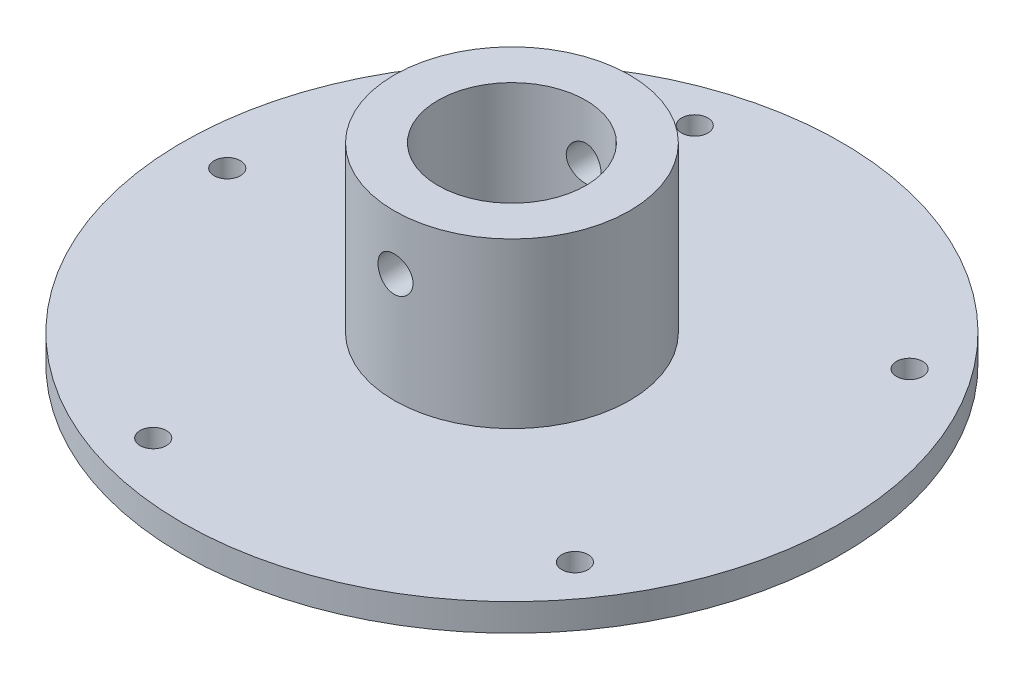
ISO-10303-21;
HEADER;
FILE_DESCRIPTION(('STEP AP214'),'2;1');
FILE_NAME('part.step','',(''),(''),'','','');
FILE_SCHEMA(('AUTOMOTIVE_DESIGN { 1 0 10303 214 1 1 1 1 }'));
ENDSEC;
DATA;
#1=APPLICATION_CONTEXT('core data for automotive mechanical design processes');
#2=APPLICATION_PROTOCOL_DEFINITION('international standard','automotive_design',2000,#1);
#3=PRODUCT_CONTEXT('',#1,'mechanical');
#4=PRODUCT('Part','Part','',(#3));
#5=PRODUCT_RELATED_PRODUCT_CATEGORY('part','',(#4));
#6=PRODUCT_DEFINITION_FORMATION('','',#4);
#7=PRODUCT_DEFINITION_CONTEXT('part definition',#1,'design');
#8=PRODUCT_DEFINITION('design','',#6,#7);
#9=PRODUCT_DEFINITION_SHAPE('','',#8);
#10=(LENGTH_UNIT() NAMED_UNIT(*) SI_UNIT(.MILLI.,.METRE.));
#11=(NAMED_UNIT(*) PLANE_ANGLE_UNIT() SI_UNIT($,.RADIAN.));
#12=(NAMED_UNIT(*) SI_UNIT($,.STERADIAN.) SOLID_ANGLE_UNIT());
#13=UNCERTAINTY_MEASURE_WITH_UNIT(LENGTH_MEASURE(1.E-05),#10,'distance_accuracy_value','');
#14=(GEOMETRIC_REPRESENTATION_CONTEXT(3) GLOBAL_UNCERTAINTY_ASSIGNED_CONTEXT((#13)) GLOBAL_UNIT_ASSIGNED_CONTEXT((#10,
#11,#12)) REPRESENTATION_CONTEXT('',''));
#15=CARTESIAN_POINT('',(0.,0.,0.));
#16=DIRECTION('',(0.,0.,1.));
#17=DIRECTION('',(1.,0.,0.));
#18=AXIS2_PLACEMENT_3D('',#15,#16,#17);
#19=CARTESIAN_POINT('',(0.,2.5,0.));
#20=DIRECTION('',(0.,1.,0.));
#21=DIRECTION('',(0.,0.,1.));
#22=AXIS2_PLACEMENT_3D('',#19,#20,#21);
#23=PLANE('',#22);
#24=CARTESIAN_POINT('',(-8.03444185374863,2.5,24.727469423674));
#25=DIRECTION('',(0.,1.,0.));
#26=DIRECTION('',(0.,0.,1.));
#27=AXIS2_PLACEMENT_3D('',#24,#25,#26);
#28=CIRCLE('',#27,1.2);
#29=CARTESIAN_POINT('',(-8.03444185374863,2.5,25.927469423674));
#30=VERTEX_POINT('',#29);
#31=EDGE_CURVE('E148',#30,#30,#28,.T.);
#32=ORIENTED_EDGE('',*,*,#31,.F.);
#33=EDGE_LOOP('',(#32));
#34=FACE_BOUND('',#33,.T.);
#35=CARTESIAN_POINT('',(21.0344418537486,2.5,-15.2824165596043));
#36=DIRECTION('',(0.,1.,0.));
#37=DIRECTION('',(0.,0.,1.));
#38=AXIS2_PLACEMENT_3D('',#35,#36,#37);
#39=CIRCLE('',#38,1.2);
#40=CARTESIAN_POINT('',(21.0344418537486,2.5,-14.0824165596043));
#41=VERTEX_POINT('',#40);
#42=EDGE_CURVE('E162',#41,#41,#39,.T.);
#43=ORIENTED_EDGE('',*,*,#42,.F.);
#44=EDGE_LOOP('',(#43));
#45=FACE_BOUND('',#44,.T.);
#46=CARTESIAN_POINT('',(0.,2.5,0.));
#47=DIRECTION('',(0.,1.,0.));
#48=DIRECTION('',(0.,0.,1.));
#49=AXIS2_PLACEMENT_3D('',#46,#47,#48);
#50=CIRCLE('',#49,30.1);
#51=CARTESIAN_POINT('',(0.,2.5,30.1));
#52=VERTEX_POINT('',#51);
#53=EDGE_CURVE('E10',#52,#52,#50,.T.);
#54=ORIENTED_EDGE('',*,*,#53,.T.);
#55=EDGE_LOOP('',(#54));
#56=FACE_BOUND('',#55,.T.);
#57=CARTESIAN_POINT('',(-26.,2.5,0.));
#58=DIRECTION('',(0.,1.,0.));
#59=DIRECTION('',(0.,0.,1.));
#60=AXIS2_PLACEMENT_3D('',#57,#58,#59);
#61=CIRCLE('',#60,1.2);
#62=CARTESIAN_POINT('',(-26.,2.5,1.2));
#63=VERTEX_POINT('',#62);
#64=EDGE_CURVE('E65',#63,#63,#61,.T.);
#65=ORIENTED_EDGE('',*,*,#64,.F.);
#66=EDGE_LOOP('',(#65));
#67=FACE_BOUND('',#66,.T.);
#68=CARTESIAN_POINT('',(-8.03444185374864,2.5,-24.727469423674));
#69=DIRECTION('',(0.,1.,0.));
#70=DIRECTION('',(0.,0.,1.));
#71=AXIS2_PLACEMENT_3D('',#68,#69,#70);
#72=CIRCLE('',#71,1.2);
#73=CARTESIAN_POINT('',(-8.03444185374864,2.5,-23.527469423674));
#74=VERTEX_POINT('',#73);
#75=EDGE_CURVE('E166',#74,#74,#72,.T.);
#76=ORIENTED_EDGE('',*,*,#75,.F.);
#77=EDGE_LOOP('',(#76));
#78=FACE_BOUND('',#77,.T.);
#79=CARTESIAN_POINT('',(21.0344418537486,2.5,15.2824165596043));
#80=DIRECTION('',(0.,1.,0.));
#81=DIRECTION('',(0.,0.,1.));
#82=AXIS2_PLACEMENT_3D('',#79,#80,#81);
#83=CIRCLE('',#82,1.2);
#84=CARTESIAN_POINT('',(21.0344418537486,2.5,16.4824165596043));
#85=VERTEX_POINT('',#84);
#86=EDGE_CURVE('E158',#85,#85,#83,.T.);
#87=ORIENTED_EDGE('',*,*,#86,.F.);
#88=EDGE_LOOP('',(#87));
#89=FACE_BOUND('',#88,.T.);
#90=CARTESIAN_POINT('',(0.,2.5,0.));
#91=DIRECTION('',(0.,1.,0.));
#92=DIRECTION('',(0.,0.,1.));
#93=AXIS2_PLACEMENT_3D('',#90,#91,#92);
#94=CIRCLE('',#93,10.75);
#95=CARTESIAN_POINT('',(0.,2.5,10.75));
#96=VERTEX_POINT('',#95);
#97=EDGE_CURVE('E154',#96,#96,#94,.T.);
#98=ORIENTED_EDGE('',*,*,#97,.F.);
#99=EDGE_LOOP('',(#98));
#100=FACE_BOUND('',#99,.T.);
#101=ADVANCED_FACE('F47',(#34,#45,#56,#67,#78,#89,#100),#23,.T.);
#102=CARTESIAN_POINT('',(0.,0.,0.));
#103=DIRECTION('',(0.,1.,0.));
#104=DIRECTION('',(0.,0.,1.));
#105=AXIS2_PLACEMENT_3D('',#102,#103,#104);
#106=PLANE('',#105);
#107=CARTESIAN_POINT('',(0.,0.,0.));
#108=DIRECTION('',(0.,1.,0.));
#109=DIRECTION('',(0.,0.,1.));
#110=AXIS2_PLACEMENT_3D('',#107,#108,#109);
#111=CIRCLE('',#110,30.1);
#112=CARTESIAN_POINT('',(0.,0.,30.1));
#113=VERTEX_POINT('',#112);
#114=EDGE_CURVE('E60',#113,#113,#111,.T.);
#115=ORIENTED_EDGE('',*,*,#114,.F.);
#116=EDGE_LOOP('',(#115));
#117=FACE_BOUND('',#116,.T.);
#118=CARTESIAN_POINT('',(-26.,0.,0.));
#119=DIRECTION('',(0.,1.,0.));
#120=DIRECTION('',(0.,0.,1.));
#121=AXIS2_PLACEMENT_3D('',#118,#119,#120);
#122=CIRCLE('',#121,1.2);
#123=CARTESIAN_POINT('',(-26.,0.,1.2));
#124=VERTEX_POINT('',#123);
#125=EDGE_CURVE('E68',#124,#124,#122,.T.);
#126=ORIENTED_EDGE('',*,*,#125,.T.);
#127=EDGE_LOOP('',(#126));
#128=FACE_BOUND('',#127,.T.);
#129=CARTESIAN_POINT('',(0.,0.,0.));
#130=DIRECTION('',(0.,1.,0.));
#131=DIRECTION('',(0.,0.,1.));
#132=AXIS2_PLACEMENT_3D('',#129,#130,#131);
#133=CIRCLE('',#132,6.75);
#134=CARTESIAN_POINT('',(0.,0.,6.75));
#135=VERTEX_POINT('',#134);
#136=EDGE_CURVE('E131',#135,#135,#133,.T.);
#137=ORIENTED_EDGE('',*,*,#136,.T.);
#138=EDGE_LOOP('',(#137));
#139=FACE_BOUND('',#138,.T.);
#140=CARTESIAN_POINT('',(-8.03444185374864,0.,-24.727469423674));
#141=DIRECTION('',(0.,1.,0.));
#142=DIRECTION('',(0.,0.,1.));
#143=AXIS2_PLACEMENT_3D('',#140,#141,#142);
#144=CIRCLE('',#143,1.2);
#145=CARTESIAN_POINT('',(-8.03444185374864,0.,-23.527469423674));
#146=VERTEX_POINT('',#145);
#147=EDGE_CURVE('E135',#146,#146,#144,.T.);
#148=ORIENTED_EDGE('',*,*,#147,.T.);
#149=EDGE_LOOP('',(#148));
#150=FACE_BOUND('',#149,.T.);
#151=CARTESIAN_POINT('',(21.0344418537486,0.,-15.2824165596043));
#152=DIRECTION('',(0.,1.,0.));
#153=DIRECTION('',(0.,0.,1.));
#154=AXIS2_PLACEMENT_3D('',#151,#152,#153);
#155=CIRCLE('',#154,1.2);
#156=CARTESIAN_POINT('',(21.0344418537486,0.,-14.0824165596043));
#157=VERTEX_POINT('',#156);
#158=EDGE_CURVE('E139',#157,#157,#155,.T.);
#159=ORIENTED_EDGE('',*,*,#158,.T.);
#160=EDGE_LOOP('',(#159));
#161=FACE_BOUND('',#160,.T.);
#162=CARTESIAN_POINT('',(21.0344418537486,0.,15.2824165596043));
#163=DIRECTION('',(0.,1.,0.));
#164=DIRECTION('',(0.,0.,1.));
#165=AXIS2_PLACEMENT_3D('',#162,#163,#164);
#166=CIRCLE('',#165,1.2);
#167=CARTESIAN_POINT('',(21.0344418537486,0.,16.4824165596043));
#168=VERTEX_POINT('',#167);
#169=EDGE_CURVE('E143',#168,#168,#166,.T.);
#170=ORIENTED_EDGE('',*,*,#169,.T.);
#171=EDGE_LOOP('',(#170));
#172=FACE_BOUND('',#171,.T.);
#173=CARTESIAN_POINT('',(-8.03444185374863,0.,24.727469423674));
#174=DIRECTION('',(0.,1.,0.));
#175=DIRECTION('',(0.,0.,1.));
#176=AXIS2_PLACEMENT_3D('',#173,#174,#175);
#177=CIRCLE('',#176,1.2);
#178=CARTESIAN_POINT('',(-8.03444185374863,0.,25.927469423674));
#179=VERTEX_POINT('',#178);
#180=EDGE_CURVE('E146',#179,#179,#177,.T.);
#181=ORIENTED_EDGE('',*,*,#180,.T.);
#182=EDGE_LOOP('',(#181));
#183=FACE_BOUND('',#182,.T.);
#184=ADVANCED_FACE('F115',(#117,#128,#139,#150,#161,#172,#183),#106,.F.);
#185=CARTESIAN_POINT('',(0.,2.5,0.));
#186=DIRECTION('',(0.,-1.,0.));
#187=DIRECTION('',(0.,0.,-1.));
#188=AXIS2_PLACEMENT_3D('',#185,#186,#187);
#189=CYLINDRICAL_SURFACE('',#188,30.1);
#190=ORIENTED_EDGE('',*,*,#53,.F.);
#191=EDGE_LOOP('',(#190));
#192=FACE_BOUND('',#191,.T.);
#193=ORIENTED_EDGE('',*,*,#114,.T.);
#194=EDGE_LOOP('',(#193));
#195=FACE_BOUND('',#194,.T.);
#196=ADVANCED_FACE('F49',(#192,#195),#189,.T.);
#197=CARTESIAN_POINT('',(-26.,2.5,0.));
#198=DIRECTION('',(0.,-1.,0.));
#199=DIRECTION('',(0.,0.,-1.));
#200=AXIS2_PLACEMENT_3D('',#197,#198,#199);
#201=CYLINDRICAL_SURFACE('',#200,1.2);
#202=ORIENTED_EDGE('',*,*,#64,.T.);
#203=EDGE_LOOP('',(#202));
#204=FACE_BOUND('',#203,.T.);
#205=ORIENTED_EDGE('',*,*,#125,.F.);
#206=EDGE_LOOP('',(#205));
#207=FACE_BOUND('',#206,.T.);
#208=ADVANCED_FACE('F107',(#204,#207),#201,.F.);
#209=CARTESIAN_POINT('',(0.,2.5,0.));
#210=DIRECTION('',(0.,-1.,0.));
#211=DIRECTION('',(0.,0.,-1.));
#212=AXIS2_PLACEMENT_3D('',#209,#210,#211);
#213=CYLINDRICAL_SURFACE('',#212,6.75);
#214=CARTESIAN_POINT('',(0.,14.1,-6.75));
#215=CARTESIAN_POINT('',(-0.0885467459976665,14.0999972660052,-6.74999842240776));
#216=CARTESIAN_POINT('',(-0.177125052248705,14.0926247338257,-6.74824015080951));
#217=CARTESIAN_POINT('',(-0.35175268834579,14.0633677164387,-6.74139618066928));
#218=CARTESIAN_POINT('',(-0.437800388869684,14.0414740866274,-6.73630838539989));
#219=CARTESIAN_POINT('',(-0.604818983467052,13.9839093362643,-6.7233700968269));
#220=CARTESIAN_POINT('',(-0.685795516207059,13.9482538455096,-6.71552273854522));
#221=CARTESIAN_POINT('',(-0.840616395882965,13.8642302299454,-6.6979058565275));
#222=CARTESIAN_POINT('',(-0.914460681493973,13.8158619958417,-6.68813631626623));
#223=CARTESIAN_POINT('',(-1.05429953541928,13.7068320717629,-6.66753606677378));
#224=CARTESIAN_POINT('',(-1.12014205689873,13.6459781958204,-6.65669033487063));
#225=CARTESIAN_POINT('',(-1.24078816566314,13.5141163586884,-6.63526243695853));
#226=CARTESIAN_POINT('',(-1.29559062483975,13.4431073610828,-6.62468029798106));
#227=CARTESIAN_POINT('',(-1.39329696380655,13.2917946177614,-6.60482778769466));
#228=CARTESIAN_POINT('',(-1.43603429528068,13.2113805882928,-6.59557656819313));
#229=CARTESIAN_POINT('',(-1.50732737001768,13.0442555485387,-6.57965102444423));
#230=CARTESIAN_POINT('',(-1.53588513113849,12.9575454362467,-6.57297633356786));
#231=CARTESIAN_POINT('',(-1.57749664498526,12.7819521286595,-6.56311341578162));
#232=CARTESIAN_POINT('',(-1.59082202646352,12.69313680622,-6.55986418939188));
#233=CARTESIAN_POINT('',(-1.60243598973627,12.5144763982395,-6.5570372464827));
#234=CARTESIAN_POINT('',(-1.6007267573228,12.4246314642843,-6.55745899626204));
#235=CARTESIAN_POINT('',(-1.58253753197549,12.2485167320042,-6.56187134977155));
#236=CARTESIAN_POINT('',(-1.56637766163781,12.1622116345404,-6.56578460262028));
#237=CARTESIAN_POINT('',(-1.5202550414682,11.9935736082345,-6.57661618912398));
#238=CARTESIAN_POINT('',(-1.4902913974051,11.9112409371145,-6.58353471746397));
#239=CARTESIAN_POINT('',(-1.41712999621285,11.7520087110939,-6.59967053852059));
#240=CARTESIAN_POINT('',(-1.37381310903549,11.6751660614765,-6.60890837927502));
#241=CARTESIAN_POINT('',(-1.27525832589494,11.5297237654572,-6.62862993165693));
#242=CARTESIAN_POINT('',(-1.22001853987624,11.4611254286571,-6.63911384069657));
#243=CARTESIAN_POINT('',(-1.09751215229141,11.3322807159391,-6.66047463061087));
#244=CARTESIAN_POINT('',(-1.02997449121583,11.2722923013225,-6.67135471054876));
#245=CARTESIAN_POINT('',(-0.885670055483701,11.1644468905068,-6.69203954285696));
#246=CARTESIAN_POINT('',(-0.808903052175678,11.1165901949553,-6.70184426857448));
#247=CARTESIAN_POINT('',(-0.647973944156736,11.0342854707371,-6.71931475075914));
#248=CARTESIAN_POINT('',(-0.563791486038777,10.9998758506706,-6.72697436277816));
#249=CARTESIAN_POINT('',(-0.390616101404577,10.9457655983126,-6.73924656819887));
#250=CARTESIAN_POINT('',(-0.301624002471458,10.9260624441021,-6.7438596840093));
#251=CARTESIAN_POINT('',(-0.123564069782312,10.9023102946806,-6.74944307807456));
#252=CARTESIAN_POINT('',(-0.0345456559555709,10.897909557113,-6.75049519433118));
#253=CARTESIAN_POINT('',(0.142954927580018,10.903927309146,-6.74906951828329));
#254=CARTESIAN_POINT('',(0.231437139818439,10.9143446075654,-6.74659200971559));
#255=CARTESIAN_POINT('',(0.404155760957046,10.9494119445732,-6.7384375709791));
#256=CARTESIAN_POINT('',(0.488432669205828,10.9738732660132,-6.73280308653847));
#257=CARTESIAN_POINT('',(0.651684780163867,11.0361213490372,-6.71896751082311));
#258=CARTESIAN_POINT('',(0.730659479907515,11.0739093726674,-6.71076617647452));
#259=CARTESIAN_POINT('',(0.882488618101901,11.1624417267007,-6.69250786185583));
#260=CARTESIAN_POINT('',(0.955222306661916,11.2133872142324,-6.68242281231961));
#261=CARTESIAN_POINT('',(1.09123380794858,11.3265279555877,-6.66156524879143));
#262=CARTESIAN_POINT('',(1.15451016000363,11.3887249439167,-6.65079262897116));
#263=CARTESIAN_POINT('',(1.2712354218353,11.5242288062088,-6.62948448994936));
#264=CARTESIAN_POINT('',(1.32443884905557,11.5977490988578,-6.61895932504614));
#265=CARTESIAN_POINT('',(1.41774864155617,11.7528850331603,-6.59960367442482));
#266=CARTESIAN_POINT('',(1.45785559282013,11.8345003124019,-6.59077311289132));
#267=CARTESIAN_POINT('',(1.52354397242058,12.0030639069682,-6.57589907795));
#268=CARTESIAN_POINT('',(1.54921076476471,12.089977441058,-6.56983926583011));
#269=CARTESIAN_POINT('',(1.58552769310262,12.2670491519432,-6.5611703994858));
#270=CARTESIAN_POINT('',(1.59618072399838,12.3572066997999,-6.55856068003236));
#271=CARTESIAN_POINT('',(1.60202823334765,12.5357195017582,-6.55713448126703));
#272=CARTESIAN_POINT('',(1.59761362189014,12.6240614008388,-6.55822207704463));
#273=CARTESIAN_POINT('',(1.57433690579569,12.7987031316494,-6.56384825788693));
#274=CARTESIAN_POINT('',(1.55547503686714,12.8850029966716,-6.56838678664932));
#275=CARTESIAN_POINT('',(1.5040424800089,13.052735091893,-6.5803527973625));
#276=CARTESIAN_POINT('',(1.47153807722649,13.134188712417,-6.58776629758582));
#277=CARTESIAN_POINT('',(1.393796961333,13.2905411277289,-6.60465027872568));
#278=CARTESIAN_POINT('',(1.34855866445426,13.3654391056441,-6.61412101547586));
#279=CARTESIAN_POINT('',(1.24537798960394,13.5084597308296,-6.63433148946762));
#280=CARTESIAN_POINT('',(1.18716115787731,13.5763809276535,-6.64509588733773));
#281=CARTESIAN_POINT('',(1.06022015576734,13.7016175867452,-6.66652599834385));
#282=CARTESIAN_POINT('',(0.991493528038871,13.7589305617091,-6.67719168778023));
#283=CARTESIAN_POINT('',(0.844171355186665,13.8622021006717,-6.69742365607399));
#284=CARTESIAN_POINT('',(0.765436829119039,13.9079665998168,-6.70696986264716));
#285=CARTESIAN_POINT('',(0.601176839377275,13.9855376938782,-6.7236804239982));
#286=CARTESIAN_POINT('',(0.515656664363882,14.0173550352788,-6.73084661157916));
#287=CARTESIAN_POINT('',(0.358483799104611,14.0609934860862,-6.74083486812365));
#288=CARTESIAN_POINT('',(0.287626503706448,14.0755909524468,-6.74424920218344));
#289=CARTESIAN_POINT('',(0.144519757146282,14.0950950315821,-6.74883234390557));
#290=CARTESIAN_POINT('',(0.0722703905906942,14.1000022314414,-6.75000128760471));
#291=CARTESIAN_POINT('',(0.,14.1,-6.75));
#292=B_SPLINE_CURVE_WITH_KNOTS('',3,(#214,#215,#216,#217,#218,#219,#220,#221,#222,#223,#224,
#225,#226,#227,#228,#229,#230,#231,#232,#233,#234,#235,#236,#237,#238,#239,#240,#241,#242,#243,
#244,#245,#246,#247,#248,#249,#250,#251,#252,#253,#254,#255,#256,#257,#258,#259,#260,#261,#262,
#263,#264,#265,#266,#267,#268,#269,#270,#271,#272,#273,#274,#275,#276,#277,#278,#279,#280,#281,
#282,#283,#284,#285,#286,#287,#288,#289,#290,#291),.UNSPECIFIED.,.T.,.F.,(4,2,2,2,2,2,2,2,2,2,2,
2,2,2,2,2,2,2,2,2,2,2,2,2,2,2,2,2,2,2,2,2,2,2,2,2,2,2,4),(0.,0.265375528001284,
0.530918334066918,0.796160437694691,1.06140482173916,1.33108809544381,1.60079891227306,
1.87406866464982,2.14729951756186,2.41557805614947,2.68381759197936,2.94625815375063,
3.20871571924424,3.47358608014374,3.73849846000654,4.01017460386332,4.2818574797226,
4.55431078296761,4.82671735417709,5.0928194143788,5.35890008457621,5.62148628356511,
5.88409735629591,6.15098919621092,6.41792221467233,6.69069923560779,6.96346404984117,
7.23459898068121,7.50568162505815,7.76978541877239,8.03388490369972,8.29671579390499,
8.55957938794182,8.82864241855379,9.09776845652809,9.37115399397792,9.64432851210617,
9.86093675556643,10.0775318754184),.UNSPECIFIED.);
#293=CARTESIAN_POINT('',(0.,14.1,-6.75));
#294=VERTEX_POINT('',#293);
#295=EDGE_CURVE('E96',#294,#294,#292,.T.);
#296=ORIENTED_EDGE('',*,*,#295,.F.);
#297=EDGE_LOOP('',(#296));
#298=FACE_BOUND('',#297,.T.);
#299=CARTESIAN_POINT('',(1.6,12.5,6.55762914474431));
#300=CARTESIAN_POINT('',(1.59999724038591,12.4114926554326,6.55763090198146));
#301=CARTESIAN_POINT('',(1.59263104401953,12.3229536922919,6.55944054767774));
#302=CARTESIAN_POINT('',(1.56340147014661,12.1484076971284,6.56646737364905));
#303=CARTESIAN_POINT('',(1.54152878368981,12.0624023279737,6.57168674194267));
#304=CARTESIAN_POINT('',(1.48402524277983,11.8954734735447,6.5849094306668));
#305=CARTESIAN_POINT('',(1.4484109970137,11.8145439900699,6.5929093891935));
#306=CARTESIAN_POINT('',(1.364484661481,11.6598027024862,6.61078774514473));
#307=CARTESIAN_POINT('',(1.31617237167604,11.5859910105324,6.62066617216099));
#308=CARTESIAN_POINT('',(1.20720029799358,11.4461185447774,6.64140723440179));
#309=CARTESIAN_POINT('',(1.14633574009971,11.3802194128661,6.65228427625695));
#310=CARTESIAN_POINT('',(1.0144283691697,11.2594631372462,6.67367154180816));
#311=CARTESIAN_POINT('',(0.943384677018733,11.2046069482401,6.68418173372383));
#312=CARTESIAN_POINT('',(0.792038385528869,11.1068417714149,6.70380943211337));
#313=CARTESIAN_POINT('',(0.7116314505568,11.064090160983,6.71290795415796));
#314=CARTESIAN_POINT('',(0.544521662372627,10.9927687690632,6.72852349347548));
#315=CARTESIAN_POINT('',(0.45781964347332,10.9641971121677,6.73504085210403));
#316=CARTESIAN_POINT('',(0.282264212804483,10.9225604202657,6.74465790637561));
#317=CARTESIAN_POINT('',(0.193479176314162,10.9092212662314,6.74781794423229));
#318=CARTESIAN_POINT('',(0.0148790400068603,10.8975692426328,6.750574065742));
#319=CARTESIAN_POINT('',(-0.0749359207185498,10.8992543673576,6.75017062511227));
#320=CARTESIAN_POINT('',(-0.25115017140018,10.9174028987365,6.74589068103284));
#321=CARTESIAN_POINT('',(-0.337581855130001,10.9335706079424,6.74208367277236));
#322=CARTESIAN_POINT('',(-0.506468883139857,10.9797518333602,6.73150450382646));
#323=CARTESIAN_POINT('',(-0.588924028230867,11.0097660423638,6.72473219477689));
#324=CARTESIAN_POINT('',(-0.748314326292084,11.0830370035725,6.70887469736064));
#325=CARTESIAN_POINT('',(-0.825197814754587,11.1264019123421,6.69977072491974));
#326=CARTESIAN_POINT('',(-0.970701965024963,11.2250618916029,6.68024212952259));
#327=CARTESIAN_POINT('',(-1.03932131840574,11.2803588473879,6.6698172979748));
#328=CARTESIAN_POINT('',(-1.16811109550914,11.4029092593165,6.64848758454143));
#329=CARTESIAN_POINT('',(-1.22803475327009,11.4704213431953,6.63757719537336));
#330=CARTESIAN_POINT('',(-1.33576123454166,11.6146504250202,6.61674097405485));
#331=CARTESIAN_POINT('',(-1.38356360252602,11.6913677687467,6.60681517891466));
#332=CARTESIAN_POINT('',(-1.46582738476746,11.8522768094177,6.58905429217681));
#333=CARTESIAN_POINT('',(-1.5002349300881,11.9364970464237,6.58122768113732));
#334=CARTESIAN_POINT('',(-1.55432980056571,12.1097554463121,6.56866335742462));
#335=CARTESIAN_POINT('',(-1.57401991899601,12.1987926915155,6.56392505863138));
#336=CARTESIAN_POINT('',(-1.59772314288211,12.3768836052499,6.55819542433314));
#337=CARTESIAN_POINT('',(-1.60209871868481,12.46588630112,6.55711747305241));
#338=CARTESIAN_POINT('',(-1.59603628414356,12.6433496997472,6.55859571903881));
#339=CARTESIAN_POINT('',(-1.58559948605464,12.7318104462628,6.56115161890905));
#340=CARTESIAN_POINT('',(-1.55052500903352,12.9043693269279,6.56952709186592));
#341=CARTESIAN_POINT('',(-1.52609342493998,12.9885118690003,6.57529926740666));
#342=CARTESIAN_POINT('',(-1.46394908029379,13.1515082261592,6.58941287624418));
#343=CARTESIAN_POINT('',(-1.42623487208025,13.2303614636537,6.59775458958008));
#344=CARTESIAN_POINT('',(-1.33782014689707,13.3820907902337,6.61625313777879));
#345=CARTESIAN_POINT('',(-1.28690008832905,13.4548352496429,6.62643968244959));
#346=CARTESIAN_POINT('',(-1.17380080048844,13.590880062028,6.64740494281583));
#347=CARTESIAN_POINT('',(-1.11161991606551,13.6541790241781,6.65818374540068));
#348=CARTESIAN_POINT('',(-0.976110427844523,13.7709778363796,6.67940913632208));
#349=CARTESIAN_POINT('',(-0.902564672999142,13.824228473196,6.68984300661689));
#350=CARTESIAN_POINT('',(-0.747362813348458,13.9176211379169,6.7089531815724));
#351=CARTESIAN_POINT('',(-0.665707117233379,13.9577638259431,6.71762957473201));
#352=CARTESIAN_POINT('',(-0.497149449133628,14.02347166128,6.73219440382001));
#353=CARTESIAN_POINT('',(-0.410288324415103,14.0491371523677,6.73810198128987));
#354=CARTESIAN_POINT('',(-0.233329132179487,14.0854691340192,6.74654694158455));
#355=CARTESIAN_POINT('',(-0.143231625176033,14.0961382091112,6.74908490513476));
#356=CARTESIAN_POINT('',(0.0352913478788954,14.1020415328171,6.75048373886061));
#357=CARTESIAN_POINT('',(0.123704099570336,14.0976453359067,6.74943265154239));
#358=CARTESIAN_POINT('',(0.298492542964413,14.0743808296618,6.74396388140155));
#359=CARTESIAN_POINT('',(0.384868284367877,14.0555128737999,6.73954628080598));
#360=CARTESIAN_POINT('',(0.552787072727697,14.0040299946954,6.72785148222993));
#361=CARTESIAN_POINT('',(0.63434966699111,13.9714757720416,6.72058692047198));
#362=CARTESIAN_POINT('',(0.790899887547021,13.8936007902554,6.70396758650733));
#363=CARTESIAN_POINT('',(0.865886760854548,13.8482785715581,6.69461257535762));
#364=CARTESIAN_POINT('',(1.00893146951302,13.7449935397813,6.67457062019878));
#365=CARTESIAN_POINT('',(1.07680190581806,13.6867759596028,6.66385902174307));
#366=CARTESIAN_POINT('',(1.201935843079,13.559855802036,6.64243100502588));
#367=CARTESIAN_POINT('',(1.25919671498976,13.4911506335002,6.63171458622762));
#368=CARTESIAN_POINT('',(1.36239661923111,13.3438563184198,6.61129297849631));
#369=CARTESIAN_POINT('',(1.40813568991232,13.2651242002394,6.60160714069804));
#370=CARTESIAN_POINT('',(1.48565986471607,13.1008726171089,6.58459577441483));
#371=CARTESIAN_POINT('',(1.51745584732043,13.0153585052482,6.57726840702859));
#372=CARTESIAN_POINT('',(1.5610472115791,12.8582385811401,6.56704021294937));
#373=CARTESIAN_POINT('',(1.57562436457497,12.7874308160578,6.56353623315115));
#374=CARTESIAN_POINT('',(1.59510155662345,12.6444223218728,6.55883006013546));
#375=CARTESIAN_POINT('',(1.60000225183557,12.5722216875557,6.55762771084487));
#376=CARTESIAN_POINT('',(1.6,12.5,6.55762914474431));
#377=B_SPLINE_CURVE_WITH_KNOTS('',3,(#299,#300,#301,#302,#303,#304,#305,#306,#307,#308,#309,
#310,#311,#312,#313,#314,#315,#316,#317,#318,#319,#320,#321,#322,#323,#324,#325,#326,#327,#328,
#329,#330,#331,#332,#333,#334,#335,#336,#337,#338,#339,#340,#341,#342,#343,#344,#345,#346,#347,
#348,#349,#350,#351,#352,#353,#354,#355,#356,#357,#358,#359,#360,#361,#362,#363,#364,#365,#366,
#367,#368,#369,#370,#371,#372,#373,#374,#375,#376),.UNSPECIFIED.,.T.,.F.,(4,2,2,2,2,2,2,2,2,2,2,
2,2,2,2,2,2,2,2,2,2,2,2,2,2,2,2,2,2,2,2,2,2,2,2,2,2,2,4),(0.,0.265257052232813,
0.530684487304297,0.795792114316842,1.06090391794735,1.33074209372954,1.600603587987,
1.87382753111077,2.14701532863468,2.41520537237053,2.68335961381263,2.94616056483035,
3.20897466618165,3.47397654118937,3.73902031786866,4.01052574460028,4.28204137317799,
4.55463792546807,4.82718272753288,5.09323151963804,5.35925853937957,5.62146508049174,
5.88370020809979,6.15061065905751,6.41756037321101,6.69044646072289,6.96331880345665,
7.23427582205776,7.50518613737007,7.76949901664236,8.03380544028271,8.29695179093512,
8.5601282352014,8.82906021932486,9.09805875580276,9.3714460886921,9.64461974197345,
9.86108325954705,10.07753209825),.UNSPECIFIED.);
#378=CARTESIAN_POINT('',(1.6,12.5,6.55762914474431));
#379=VERTEX_POINT('',#378);
#380=EDGE_CURVE('E90',#379,#379,#377,.T.);
#381=ORIENTED_EDGE('',*,*,#380,.F.);
#382=EDGE_LOOP('',(#381));
#383=FACE_BOUND('',#382,.T.);
#384=ORIENTED_EDGE('',*,*,#136,.F.);
#385=EDGE_LOOP('',(#384));
#386=FACE_BOUND('',#385,.T.);
#387=CARTESIAN_POINT('',(0.,17.5,0.));
#388=DIRECTION('',(0.,1.,0.));
#389=DIRECTION('',(0.,0.,1.));
#390=AXIS2_PLACEMENT_3D('',#387,#388,#389);
#391=CIRCLE('',#390,6.75);
#392=CARTESIAN_POINT('',(0.,17.5,6.75));
#393=VERTEX_POINT('',#392);
#394=EDGE_CURVE('E182',#393,#393,#391,.T.);
#395=ORIENTED_EDGE('',*,*,#394,.T.);
#396=EDGE_LOOP('',(#395));
#397=FACE_BOUND('',#396,.T.);
#398=ADVANCED_FACE('F101',(#298,#383,#386,#397),#213,.F.);
#399=CARTESIAN_POINT('',(-8.03444185374864,2.5,-24.727469423674));
#400=DIRECTION('',(0.,-1.,0.));
#401=DIRECTION('',(0.,0.,-1.));
#402=AXIS2_PLACEMENT_3D('',#399,#400,#401);
#403=CYLINDRICAL_SURFACE('',#402,1.2);
#404=ORIENTED_EDGE('',*,*,#75,.T.);
#405=EDGE_LOOP('',(#404));
#406=FACE_BOUND('',#405,.T.);
#407=ORIENTED_EDGE('',*,*,#147,.F.);
#408=EDGE_LOOP('',(#407));
#409=FACE_BOUND('',#408,.T.);
#410=ADVANCED_FACE('F106',(#406,#409),#403,.F.);
#411=CARTESIAN_POINT('',(21.0344418537486,2.5,-15.2824165596043));
#412=DIRECTION('',(0.,-1.,0.));
#413=DIRECTION('',(0.,0.,-1.));
#414=AXIS2_PLACEMENT_3D('',#411,#412,#413);
#415=CYLINDRICAL_SURFACE('',#414,1.2);
#416=ORIENTED_EDGE('',*,*,#42,.T.);
#417=EDGE_LOOP('',(#416));
#418=FACE_BOUND('',#417,.T.);
#419=ORIENTED_EDGE('',*,*,#158,.F.);
#420=EDGE_LOOP('',(#419));
#421=FACE_BOUND('',#420,.T.);
#422=ADVANCED_FACE('F213',(#418,#421),#415,.F.);
#423=CARTESIAN_POINT('',(21.0344418537486,2.5,15.2824165596043));
#424=DIRECTION('',(0.,-1.,0.));
#425=DIRECTION('',(0.,0.,-1.));
#426=AXIS2_PLACEMENT_3D('',#423,#424,#425);
#427=CYLINDRICAL_SURFACE('',#426,1.2);
#428=ORIENTED_EDGE('',*,*,#86,.T.);
#429=EDGE_LOOP('',(#428));
#430=FACE_BOUND('',#429,.T.);
#431=ORIENTED_EDGE('',*,*,#169,.F.);
#432=EDGE_LOOP('',(#431));
#433=FACE_BOUND('',#432,.T.);
#434=ADVANCED_FACE('F208',(#430,#433),#427,.F.);
#435=CARTESIAN_POINT('',(-8.03444185374863,2.5,24.727469423674));
#436=DIRECTION('',(0.,-1.,0.));
#437=DIRECTION('',(0.,0.,-1.));
#438=AXIS2_PLACEMENT_3D('',#435,#436,#437);
#439=CYLINDRICAL_SURFACE('',#438,1.2);
#440=ORIENTED_EDGE('',*,*,#31,.T.);
#441=EDGE_LOOP('',(#440));
#442=FACE_BOUND('',#441,.T.);
#443=ORIENTED_EDGE('',*,*,#180,.F.);
#444=EDGE_LOOP('',(#443));
#445=FACE_BOUND('',#444,.T.);
#446=ADVANCED_FACE('F204',(#442,#445),#439,.F.);
#447=CARTESIAN_POINT('',(0.,17.5,0.));
#448=DIRECTION('',(0.,1.,0.));
#449=DIRECTION('',(0.,0.,1.));
#450=AXIS2_PLACEMENT_3D('',#447,#448,#449);
#451=PLANE('',#450);
#452=CARTESIAN_POINT('',(0.,17.5,0.));
#453=DIRECTION('',(0.,1.,0.));
#454=DIRECTION('',(0.,0.,1.));
#455=AXIS2_PLACEMENT_3D('',#452,#453,#454);
#456=CIRCLE('',#455,10.75);
#457=CARTESIAN_POINT('',(0.,17.5,10.75));
#458=VERTEX_POINT('',#457);
#459=EDGE_CURVE('E149',#458,#458,#456,.T.);
#460=ORIENTED_EDGE('',*,*,#459,.T.);
#461=EDGE_LOOP('',(#460));
#462=FACE_BOUND('',#461,.T.);
#463=ORIENTED_EDGE('',*,*,#394,.F.);
#464=EDGE_LOOP('',(#463));
#465=FACE_BOUND('',#464,.T.);
#466=ADVANCED_FACE('F84',(#462,#465),#451,.T.);
#467=CARTESIAN_POINT('',(0.,17.5,0.));
#468=DIRECTION('',(0.,-1.,0.));
#469=DIRECTION('',(0.,0.,-1.));
#470=AXIS2_PLACEMENT_3D('',#467,#468,#469);
#471=CYLINDRICAL_SURFACE('',#470,10.75);
#472=CARTESIAN_POINT('',(0.,14.1,-10.75));
#473=CARTESIAN_POINT('',(-0.0893432150899926,14.0999963093843,-10.7499985758113));
#474=CARTESIAN_POINT('',(-0.178738473097053,14.0924914164229,-10.7488745260962));
#475=CARTESIAN_POINT('',(-0.355030821890525,14.0626774162437,-10.7444986475207));
#476=CARTESIAN_POINT('',(-0.441925384699199,14.040353841749,-10.7412447393518));
#477=CARTESIAN_POINT('',(-0.61063948345209,13.9815838158585,-10.7329748553017));
#478=CARTESIAN_POINT('',(-0.692462780670865,13.9451479802932,-10.7279602041891));
#479=CARTESIAN_POINT('',(-0.848821283643291,13.8592135214955,-10.7167231329652));
#480=CARTESIAN_POINT('',(-0.923357511481574,13.8097167338056,-10.7105008825983));
#481=CARTESIAN_POINT('',(-1.06361236464501,13.6986594502367,-10.6974871371706));
#482=CARTESIAN_POINT('',(-1.12926678391837,13.6370182841228,-10.6906920196028));
#483=CARTESIAN_POINT('',(-1.24934042291865,13.5035955894297,-10.6773267880287));
#484=CARTESIAN_POINT('',(-1.30375900033786,13.4318134815287,-10.6707566869035));
#485=CARTESIAN_POINT('',(-1.40006563188661,13.2797158168738,-10.6585502052271));
#486=CARTESIAN_POINT('',(-1.44189165976257,13.1993605774995,-10.6529185057154));
#487=CARTESIAN_POINT('',(-1.51142953426854,13.0326678008294,-10.6432758476234));
#488=CARTESIAN_POINT('',(-1.53914213816911,12.9463305847852,-10.6392648020877));
#489=CARTESIAN_POINT('',(-1.5794673109075,12.7707994935489,-10.6333531624112));
#490=CARTESIAN_POINT('',(-1.59218973133465,12.6816313810669,-10.6314372223942));
#491=CARTESIAN_POINT('',(-1.60251368460536,12.5024068874538,-10.6298861161038));
#492=CARTESIAN_POINT('',(-1.60011607242195,12.4123505568351,-10.6302508208699));
#493=CARTESIAN_POINT('',(-1.58035781279897,12.2346814741652,-10.6332057637727));
#494=CARTESIAN_POINT('',(-1.56311944523644,12.1470547775488,-10.6357778140212));
#495=CARTESIAN_POINT('',(-1.51436039393101,11.9759515853269,-10.6428292327814));
#496=CARTESIAN_POINT('',(-1.48283931187065,11.8924752055379,-10.647308654486));
#497=CARTESIAN_POINT('',(-1.40628220673909,11.7316697975835,-10.6576902146598));
#498=CARTESIAN_POINT('',(-1.36119432175425,11.6543658258481,-10.6635977952164));
#499=CARTESIAN_POINT('',(-1.2588204333839,11.5083746162782,-10.67616609025));
#500=CARTESIAN_POINT('',(-1.20153364159233,11.439687935829,-10.6828268533916));
#501=CARTESIAN_POINT('',(-1.07571656300213,11.3121723302302,-10.6962313977354));
#502=CARTESIAN_POINT('',(-1.00708113050465,11.2534471186728,-10.702975350634));
#503=CARTESIAN_POINT('',(-0.860873626996455,11.1483332940078,-10.7157254742745));
#504=CARTESIAN_POINT('',(-0.78330151793931,11.1019447334244,-10.7217316418752));
#505=CARTESIAN_POINT('',(-0.621333249764475,11.0228159424085,-10.7323355986822));
#506=CARTESIAN_POINT('',(-0.536933161485767,10.9900836381335,-10.7369325695745));
#507=CARTESIAN_POINT('',(-0.363750415565786,10.9392862808901,-10.7441933109773));
#508=CARTESIAN_POINT('',(-0.274968050004971,10.9212202518052,-10.7468572101425));
#509=CARTESIAN_POINT('',(-0.0964361599278228,10.9004060086142,-10.7499346352547));
#510=CARTESIAN_POINT('',(-0.00670360821538248,10.8975151949493,-10.7503691099436));
#511=CARTESIAN_POINT('',(0.171964980098002,10.9067550481738,-10.7489957336742));
#512=CARTESIAN_POINT('',(0.260901040882036,10.9188852574262,-10.7471879510294));
#513=CARTESIAN_POINT('',(0.435020705017314,10.9577042515362,-10.7415461448858));
#514=CARTESIAN_POINT('',(0.520220120399737,10.9843236373372,-10.7377217829387));
#515=CARTESIAN_POINT('',(0.684946542885395,11.0512922253088,-10.7284742777482));
#516=CARTESIAN_POINT('',(0.764473286962997,11.0916420636215,-10.7230510604301));
#517=CARTESIAN_POINT('',(0.916224432229722,11.1852612463133,-10.7111565429064));
#518=CARTESIAN_POINT('',(0.988392395554507,11.2386211370534,-10.7046780077039));
#519=CARTESIAN_POINT('',(1.12279985741438,11.3566195670705,-10.6914166657513));
#520=CARTESIAN_POINT('',(1.18503878792279,11.4212587511782,-10.6846338416215));
#521=CARTESIAN_POINT('',(1.29833967027103,11.5606153967084,-10.6714620514834));
#522=CARTESIAN_POINT('',(1.3493060840992,11.6354109331602,-10.6650767588447));
#523=CARTESIAN_POINT('',(1.43795131377227,11.7925851870581,-10.6534878318153));
#524=CARTESIAN_POINT('',(1.47563048425088,11.8749637020422,-10.6482841658886));
#525=CARTESIAN_POINT('',(1.53648324904666,12.0446794302927,-10.6396741867317));
#526=CARTESIAN_POINT('',(1.5597072994736,12.1319982213815,-10.6362616281923));
#527=CARTESIAN_POINT('',(1.59115126619174,12.3093513518424,-10.6316035753863));
#528=CARTESIAN_POINT('',(1.59937220124906,12.3993855064093,-10.6303579339783));
#529=CARTESIAN_POINT('',(1.6005526174196,12.5786614638696,-10.6301801865015));
#530=CARTESIAN_POINT('',(1.59366230952604,12.6679022914958,-10.6312253093824));
#531=CARTESIAN_POINT('',(1.56513753307957,12.8439409993241,-10.6354618696158));
#532=CARTESIAN_POINT('',(1.54350308671162,12.9307388832019,-10.6386533037388));
#533=CARTESIAN_POINT('',(1.48615697076498,13.0993872931801,-10.6468149773701));
#534=CARTESIAN_POINT('',(1.45045563796862,13.1812414012973,-10.6517839104707));
#535=CARTESIAN_POINT('',(1.36600411019717,13.3378222863153,-10.6629423251029));
#536=CARTESIAN_POINT('',(1.31725348715811,13.4125488292971,-10.6691318466723));
#537=CARTESIAN_POINT('',(1.20754089531454,13.5535167943285,-10.682107307913));
#538=CARTESIAN_POINT('',(1.14646763433511,13.6196711408027,-10.6888983415466));
#539=CARTESIAN_POINT('',(1.01407855961415,13.7408457822165,-10.7022689977912));
#540=CARTESIAN_POINT('',(0.942760366993104,13.7958634840524,-10.7088485708655));
#541=CARTESIAN_POINT('',(0.791452031295773,13.8934687041387,-10.7210956071578));
#542=CARTESIAN_POINT('',(0.71141702432055,13.9359873054826,-10.7267579388096));
#543=CARTESIAN_POINT('',(0.545295433002018,14.0069149739141,-10.7364821208871));
#544=CARTESIAN_POINT('',(0.45921523846466,14.035338690575,-10.7405456321415));
#545=CARTESIAN_POINT('',(0.310621569598613,14.0708035209092,-10.7456841397842));
#546=CARTESIAN_POINT('',(0.249026371652527,14.0817355185932,-10.7472942969097));
#547=CARTESIAN_POINT('',(0.124962596513121,14.0963350048052,-10.7494527186697));
#548=CARTESIAN_POINT('',(0.062494029931565,14.1000025815217,-10.7500009961953));
#549=CARTESIAN_POINT('',(0.,14.1,-10.75));
#550=B_SPLINE_CURVE_WITH_KNOTS('',3,(#472,#473,#474,#475,#476,#477,#478,#479,#480,#481,#482,
#483,#484,#485,#486,#487,#488,#489,#490,#491,#492,#493,#494,#495,#496,#497,#498,#499,#500,#501,
#502,#503,#504,#505,#506,#507,#508,#509,#510,#511,#512,#513,#514,#515,#516,#517,#518,#519,#520,
#521,#522,#523,#524,#525,#526,#527,#528,#529,#530,#531,#532,#533,#534,#535,#536,#537,#538,#539,
#540,#541,#542,#543,#544,#545,#546,#547,#548,#549),.UNSPECIFIED.,.T.,.F.,(4,2,2,2,2,2,2,2,2,2,2,
2,2,2,2,2,2,2,2,2,2,2,2,2,2,2,2,2,2,2,2,2,2,2,2,2,2,2,4),(0.,0.26780128983532,0.535864415700392,
0.803726283733135,1.07155052738658,1.34121775062193,1.61090038537784,1.88189042649543,
2.15286592582611,2.42184305210866,2.69080496902412,2.95757176473514,3.22434600051731,
3.49215327937897,3.75997787167694,4.03043935480629,4.30090198942386,4.57152138421979,
4.84212276642079,5.11017673030963,5.37822252775169,5.64499561667202,5.91178106707184,
6.1804791063494,6.44919251197427,6.72010279830641,6.99100585355303,7.26095792972205,
7.53089167448081,7.79815435642317,8.06541663622585,8.33248288863085,8.59955790284947,
8.86916265525665,9.13883011155186,9.40995769748403,9.68080289215971,9.86812752537882,
10.0554498845062),.UNSPECIFIED.);
#551=CARTESIAN_POINT('',(0.,14.1,-10.75));
#552=VERTEX_POINT('',#551);
#553=EDGE_CURVE('E51',#552,#552,#550,.T.);
#554=ORIENTED_EDGE('',*,*,#553,.T.);
#555=EDGE_LOOP('',(#554));
#556=FACE_BOUND('',#555,.T.);
#557=CARTESIAN_POINT('',(1.6,12.5,10.6302634021928));
#558=CARTESIAN_POINT('',(1.59999630408995,12.410662963694,10.6302648866826));
#559=CARTESIAN_POINT('',(1.59249241410398,12.321273867794,10.6314017741099));
#560=CARTESIAN_POINT('',(1.56268275933832,12.1449943194917,10.6358234724459));
#561=CARTESIAN_POINT('',(1.54036250500367,12.0581063999684,10.6391103859109));
#562=CARTESIAN_POINT('',(1.48160218910215,11.8894063574159,10.647451792985));
#563=CARTESIAN_POINT('',(1.44517290039021,11.8075904168705,10.6525049377143));
#564=CARTESIAN_POINT('',(1.35925386540755,11.6512442724312,10.6638078419099));
#565=CARTESIAN_POINT('',(1.30976593896705,11.5767130553319,10.6700574346079));
#566=CARTESIAN_POINT('',(1.19871766193286,11.4364526759477,10.6831041592328));
#567=CARTESIAN_POINT('',(1.13707465658574,11.3707892758605,10.6899048408457));
#568=CARTESIAN_POINT('',(1.0036444951049,11.2506982659756,10.7032557839422));
#569=CARTESIAN_POINT('',(0.931856784336925,11.1962712708984,10.7098060317091));
#570=CARTESIAN_POINT('',(0.779754079868572,11.0999557316663,10.7219551720219));
#571=CARTESIAN_POINT('',(0.699400367553325,11.0581276965494,10.7275494193148));
#572=CARTESIAN_POINT('',(0.532710905276389,10.9885856916432,10.7371169376063));
#573=CARTESIAN_POINT('',(0.446375466879829,10.9608709873717,10.7410902929568));
#574=CARTESIAN_POINT('',(0.27085035271661,10.9205415807365,10.7469432978877));
#575=CARTESIAN_POINT('',(0.181686488134974,10.9078167907841,10.7488382046411));
#576=CARTESIAN_POINT('',(0.00247035141087404,10.8974866260422,10.7503730892357));
#577=CARTESIAN_POINT('',(-0.0875818718012363,10.8998804231198,10.7500131905856));
#578=CARTESIAN_POINT('',(-0.265267494396458,10.9196325364772,10.7470912135495));
#579=CARTESIAN_POINT('',(-0.352914386713837,10.9368724175784,10.7445465645694));
#580=CARTESIAN_POINT('',(-0.524057184631702,10.9856414552254,10.7375604285596));
#581=CARTESIAN_POINT('',(-0.607552984679169,11.0171709749188,10.7331188933238));
#582=CARTESIAN_POINT('',(-0.768382344041875,11.0937457649346,10.7228080760335));
#583=CARTESIAN_POINT('',(-0.845691780080207,11.1388409642434,10.7169335351186));
#584=CARTESIAN_POINT('',(-0.991690837827134,11.2412305795666,10.7044115468143));
#585=CARTESIAN_POINT('',(-1.06037990030854,11.2985257863794,10.697764049335));
#586=CARTESIAN_POINT('',(-1.18788639951926,11.4243489692587,10.684361644687));
#587=CARTESIAN_POINT('',(-1.24660180931004,11.4929803399018,10.6776063207424));
#588=CARTESIAN_POINT('',(-1.3516977736635,11.6391761770622,10.6648124569737));
#589=CARTESIAN_POINT('',(-1.3980782544738,11.7167406969882,10.6587739214355));
#590=CARTESIAN_POINT('',(-1.47720117525985,11.8787066324138,10.6480974634987));
#591=CARTESIAN_POINT('',(-1.50993324427816,11.9631131889858,10.6434606069208));
#592=CARTESIAN_POINT('',(-1.56072816179507,12.1363100350353,10.6361314602248));
#593=CARTESIAN_POINT('',(-1.57879202736683,12.2251000201189,10.633439035284));
#594=CARTESIAN_POINT('',(-1.59959808549041,12.4036358874574,10.6303291224957));
#595=CARTESIAN_POINT('',(-1.6024848554794,12.4933645602093,10.6298901689665));
#596=CARTESIAN_POINT('',(-1.59323829929936,12.67202442986,10.6312799196466));
#597=CARTESIAN_POINT('',(-1.58110543174161,12.7609556510248,10.6331085546172));
#598=CARTESIAN_POINT('',(-1.54228658461189,12.9350490162717,10.6388077288886));
#599=CARTESIAN_POINT('',(-1.51567253271729,13.0202275579523,10.6426681731683));
#600=CARTESIAN_POINT('',(-1.44872157425161,13.1849145824878,10.6519876725594));
#601=CARTESIAN_POINT('',(-1.40838399960501,13.2644227890768,10.6574468054949));
#602=CARTESIAN_POINT('',(-1.31478325794912,13.4161605983916,10.6693991892918));
#603=CARTESIAN_POINT('',(-1.2614264401651,13.488331841334,10.675899809943));
#604=CARTESIAN_POINT('',(-1.14343211562736,13.6227473439939,10.6891804691042));
#605=CARTESIAN_POINT('',(-1.07879398116396,13.6849910509593,10.6959605231463));
#606=CARTESIAN_POINT('',(-0.939435405655616,13.798303266277,10.7091031374247));
#607=CARTESIAN_POINT('',(-0.864636671827961,13.8492760012103,10.7154618204225));
#608=CARTESIAN_POINT('',(-0.707454240507415,13.9379323088002,10.7269851053923));
#609=CARTESIAN_POINT('',(-0.625070747975808,13.9756162404244,10.7321497396177));
#610=CARTESIAN_POINT('',(-0.455357346145965,14.0364719464556,10.7406860133768));
#611=CARTESIAN_POINT('',(-0.368046607457101,14.059696236009,10.7440641344307));
#612=CARTESIAN_POINT('',(-0.190710541561788,14.091143405828,10.7486739519454));
#613=CARTESIAN_POINT('',(-0.100685391139857,14.0993672609074,10.7499057878839));
#614=CARTESIAN_POINT('',(0.0785948048669606,14.100556605291,10.7500828803282));
#615=CARTESIAN_POINT('',(0.167848890903754,14.0936686919834,10.7490501055946));
#616=CARTESIAN_POINT('',(0.343914735750302,14.0651440581549,10.744858287035));
#617=CARTESIAN_POINT('',(0.430726502023316,14.0435073827084,10.7416992497072));
#618=CARTESIAN_POINT('',(0.599404229341582,13.9861511259734,10.7336082142348));
#619=CARTESIAN_POINT('',(0.681273653335599,13.950441540375,10.7286774747115));
#620=CARTESIAN_POINT('',(0.837881755706935,13.8659687357096,10.7175848300988));
#621=CARTESIAN_POINT('',(0.912620209682232,13.8172051060331,10.7114228862838));
#622=CARTESIAN_POINT('',(1.05358866272052,13.7074777142823,10.6984819066338));
#623=CARTESIAN_POINT('',(1.11973390634112,13.6464056647838,10.6916977073653));
#624=CARTESIAN_POINT('',(1.24089074492162,13.5140228241772,10.6783151906422));
#625=CARTESIAN_POINT('',(1.29589972232826,13.4427096326301,10.6717169172019));
#626=CARTESIAN_POINT('',(1.39349496291816,13.2914058474437,10.6594142385844));
#627=CARTESIAN_POINT('',(1.43601089002253,13.2113694750817,10.6537149750335));
#628=CARTESIAN_POINT('',(1.50693318688014,13.0452450986096,10.6439158838509));
#629=CARTESIAN_POINT('',(1.5353542347533,12.9591634970126,10.6398143932901));
#630=CARTESIAN_POINT('',(1.5708119743419,12.8105768699133,10.6346252681782));
#631=CARTESIAN_POINT('',(1.58174078775784,12.7489906122421,10.6329982143029));
#632=CARTESIAN_POINT('',(1.5963360471549,12.6249447182552,10.6308167689479));
#633=CARTESIAN_POINT('',(1.60000258503408,12.5624850930014,10.6302623638946));
#634=CARTESIAN_POINT('',(1.6,12.5,10.6302634021928));
#635=B_SPLINE_CURVE_WITH_KNOTS('',3,(#557,#558,#559,#560,#561,#562,#563,#564,#565,#566,#567,
#568,#569,#570,#571,#572,#573,#574,#575,#576,#577,#578,#579,#580,#581,#582,#583,#584,#585,#586,
#587,#588,#589,#590,#591,#592,#593,#594,#595,#596,#597,#598,#599,#600,#601,#602,#603,#604,#605,
#606,#607,#608,#609,#610,#611,#612,#613,#614,#615,#616,#617,#618,#619,#620,#621,#622,#623,#624,
#625,#626,#627,#628,#629,#630,#631,#632,#633,#634),.UNSPECIFIED.,.T.,.F.,(4,2,2,2,2,2,2,2,2,2,2,
2,2,2,2,2,2,2,2,2,2,2,2,2,2,2,2,2,2,2,2,2,2,2,2,2,2,2,4),(0.,0.267782725036049,
0.535827712791532,0.803668438871455,1.07147185880419,1.34116338318117,1.61086965791916,
1.88185132256819,2.15281888341892,2.42178377020227,2.6907339243409,2.95755818763314,
3.22438923220494,3.4922146304183,3.76005739422572,4.03049367153597,4.30093156578861,
4.57157458362763,4.8421988338469,5.11024037650121,5.37827373494722,5.64498777240492,
5.91171479564065,6.18042014840478,6.44914045711422,6.72006320423176,6.99097863241054,
7.26090430936678,7.53081244438442,7.79811382115024,8.06541438100584,8.33252542412798,
8.59964487010449,8.86922591696804,9.13887025484293,9.41000482050364,9.68085643612608,
9.86815434647712,10.0554498867135),.UNSPECIFIED.);
#636=CARTESIAN_POINT('',(1.6,12.5,10.6302634021928));
#637=VERTEX_POINT('',#636);
#638=EDGE_CURVE('E70',#637,#637,#635,.T.);
#639=ORIENTED_EDGE('',*,*,#638,.T.);
#640=EDGE_LOOP('',(#639));
#641=FACE_BOUND('',#640,.T.);
#642=ORIENTED_EDGE('',*,*,#459,.F.);
#643=EDGE_LOOP('',(#642));
#644=FACE_BOUND('',#643,.T.);
#645=ORIENTED_EDGE('',*,*,#97,.T.);
#646=EDGE_LOOP('',(#645));
#647=FACE_BOUND('',#646,.T.);
#648=ADVANCED_FACE('F75',(#556,#641,#644,#647),#471,.T.);
#649=CARTESIAN_POINT('',(0.,12.5,-30.1));
#650=DIRECTION('',(0.,0.,1.));
#651=DIRECTION('',(1.,0.,0.));
#652=AXIS2_PLACEMENT_3D('',#649,#650,#651);
#653=CYLINDRICAL_SURFACE('',#652,1.6);
#654=ORIENTED_EDGE('',*,*,#380,.T.);
#655=EDGE_LOOP('',(#654));
#656=FACE_BOUND('',#655,.T.);
#657=ORIENTED_EDGE('',*,*,#638,.F.);
#658=EDGE_LOOP('',(#657));
#659=FACE_BOUND('',#658,.T.);
#660=ADVANCED_FACE('F82',(#656,#659),#653,.F.);
#661=ORIENTED_EDGE('',*,*,#295,.T.);
#662=EDGE_LOOP('',(#661));
#663=FACE_BOUND('',#662,.T.);
#664=ORIENTED_EDGE('',*,*,#553,.F.);
#665=EDGE_LOOP('',(#664));
#666=FACE_BOUND('',#665,.T.);
#667=ADVANCED_FACE('F79',(#663,#666),#653,.F.);
#668=CLOSED_SHELL('',(#101,#184,#196,#208,#398,#410,#422,#434,#446,#466,#648,#660,#667));
#669=MANIFOLD_SOLID_BREP('B2',#668);
#670=ADVANCED_BREP_SHAPE_REPRESENTATION('',(#18,#669),#14);
#671=SHAPE_DEFINITION_REPRESENTATION(#9,#670);
ENDSEC;
END-ISO-10303-21;
